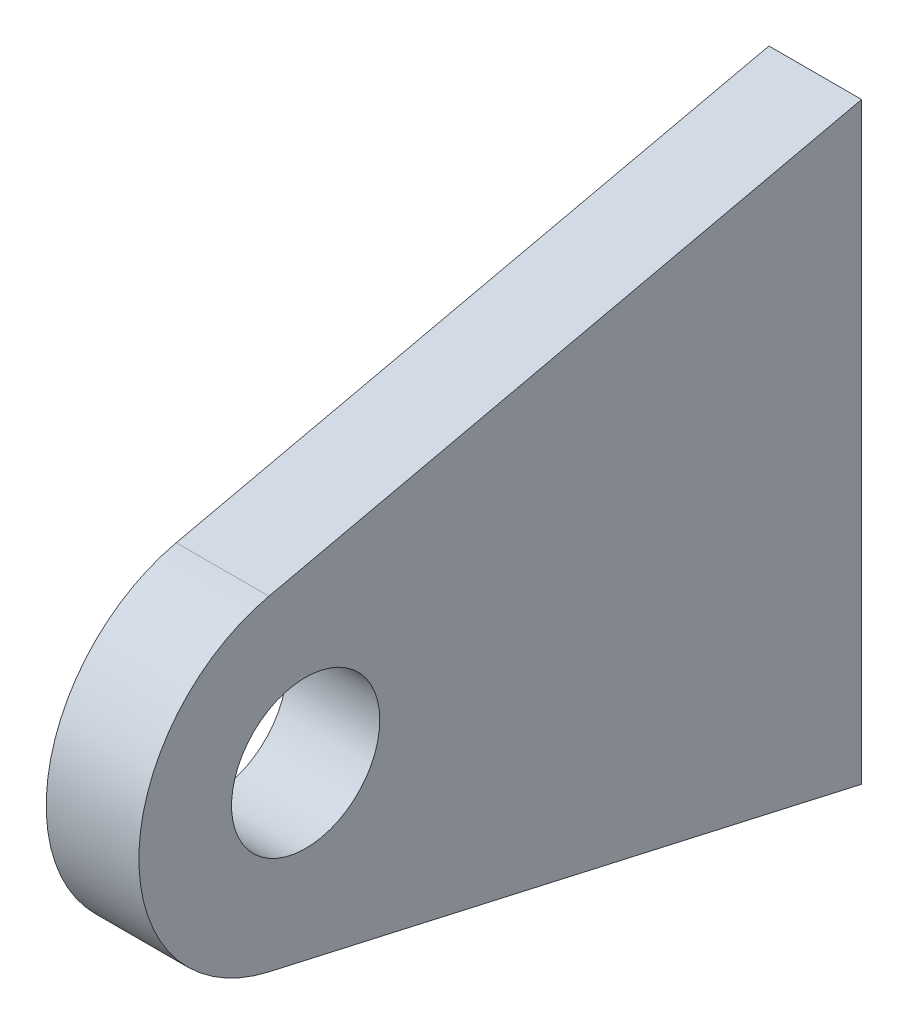
ISO-10303-21;
HEADER;
FILE_DESCRIPTION(('STEP AP214'),'2;1');
FILE_NAME('part.step','',(''),(''),'','','');
FILE_SCHEMA(('AUTOMOTIVE_DESIGN { 1 0 10303 214 1 1 1 1 }'));
ENDSEC;
DATA;
#1=APPLICATION_CONTEXT('core data for automotive mechanical design processes');
#2=APPLICATION_PROTOCOL_DEFINITION('international standard','automotive_design',2000,#1);
#3=PRODUCT_CONTEXT('',#1,'mechanical');
#4=PRODUCT('Part','Part','',(#3));
#5=PRODUCT_RELATED_PRODUCT_CATEGORY('part','',(#4));
#6=PRODUCT_DEFINITION_FORMATION('','',#4);
#7=PRODUCT_DEFINITION_CONTEXT('part definition',#1,'design');
#8=PRODUCT_DEFINITION('design','',#6,#7);
#9=PRODUCT_DEFINITION_SHAPE('','',#8);
#10=(LENGTH_UNIT() NAMED_UNIT(*) SI_UNIT(.MILLI.,.METRE.));
#11=(NAMED_UNIT(*) PLANE_ANGLE_UNIT() SI_UNIT($,.RADIAN.));
#12=(NAMED_UNIT(*) SI_UNIT($,.STERADIAN.) SOLID_ANGLE_UNIT());
#13=UNCERTAINTY_MEASURE_WITH_UNIT(LENGTH_MEASURE(1.E-05),#10,'distance_accuracy_value','');
#14=(GEOMETRIC_REPRESENTATION_CONTEXT(3) GLOBAL_UNCERTAINTY_ASSIGNED_CONTEXT((#13)) GLOBAL_UNIT_ASSIGNED_CONTEXT((#10,
#11,#12)) REPRESENTATION_CONTEXT('',''));
#15=CARTESIAN_POINT('',(0.,0.,0.));
#16=DIRECTION('',(0.,0.,1.));
#17=DIRECTION('',(1.,0.,0.));
#18=AXIS2_PLACEMENT_3D('',#15,#16,#17);
#19=CARTESIAN_POINT('',(2.5,0.,30.));
#20=DIRECTION('',(1.,0.,0.));
#21=DIRECTION('',(0.,0.,-1.));
#22=AXIS2_PLACEMENT_3D('',#19,#20,#21);
#23=PLANE('',#22);
#24=DIRECTION('',(0.,-0.220237960159308,0.975446175298703));
#25=VECTOR('',#24,1.);
#26=CARTESIAN_POINT('',(2.5,16.,0.));
#27=LINE('',#26,#25);
#28=CARTESIAN_POINT('',(2.5,16.,0.));
#29=VERTEX_POINT('',#28);
#30=CARTESIAN_POINT('',(2.5,8.77901557768832,31.9821416414338));
#31=VERTEX_POINT('',#30);
#32=EDGE_CURVE('E91',#29,#31,#27,.T.);
#33=ORIENTED_EDGE('',*,*,#32,.T.);
#34=CARTESIAN_POINT('',(2.5,0.,30.));
#35=DIRECTION('',(1.,0.,0.));
#36=DIRECTION('',(0.,0.,-1.));
#37=AXIS2_PLACEMENT_3D('',#34,#35,#36);
#38=CIRCLE('',#37,9.);
#39=CARTESIAN_POINT('',(2.5,-8.77901557768832,31.9821416414338));
#40=VERTEX_POINT('',#39);
#41=EDGE_CURVE('E86',#31,#40,#38,.T.);
#42=ORIENTED_EDGE('',*,*,#41,.T.);
#43=DIRECTION('',(0.,-0.220237960159308,-0.975446175298703));
#44=VECTOR('',#43,1.);
#45=CARTESIAN_POINT('',(2.5,-16.,0.));
#46=LINE('',#45,#44);
#47=CARTESIAN_POINT('',(2.5,-16.,0.));
#48=VERTEX_POINT('',#47);
#49=EDGE_CURVE('E89',#40,#48,#46,.T.);
#50=ORIENTED_EDGE('',*,*,#49,.T.);
#51=DIRECTION('',(0.,1.,0.));
#52=VECTOR('',#51,1.);
#53=CARTESIAN_POINT('',(2.5,-16.,0.));
#54=LINE('',#53,#52);
#55=EDGE_CURVE('E56',#48,#29,#54,.T.);
#56=ORIENTED_EDGE('',*,*,#55,.T.);
#57=EDGE_LOOP('',(#33,#42,#50,#56));
#58=FACE_BOUND('',#57,.T.);
#59=CARTESIAN_POINT('',(2.5,0.,30.));
#60=DIRECTION('',(1.,0.,0.));
#61=DIRECTION('',(0.,0.,-1.));
#62=AXIS2_PLACEMENT_3D('',#59,#60,#61);
#63=CIRCLE('',#62,4.);
#64=CARTESIAN_POINT('',(2.5,0.,26.));
#65=VERTEX_POINT('',#64);
#66=EDGE_CURVE('E106',#65,#65,#63,.T.);
#67=ORIENTED_EDGE('',*,*,#66,.F.);
#68=EDGE_LOOP('',(#67));
#69=FACE_BOUND('',#68,.T.);
#70=ADVANCED_FACE('F39',(#58,#69),#23,.T.);
#71=CARTESIAN_POINT('',(-2.5,0.,30.));
#72=DIRECTION('',(1.,0.,0.));
#73=DIRECTION('',(0.,0.,-1.));
#74=AXIS2_PLACEMENT_3D('',#71,#72,#73);
#75=PLANE('',#74);
#76=DIRECTION('',(0.,-0.220237960159308,0.975446175298703));
#77=VECTOR('',#76,1.);
#78=CARTESIAN_POINT('',(-2.5,16.,0.));
#79=LINE('',#78,#77);
#80=CARTESIAN_POINT('',(-2.5,16.,0.));
#81=VERTEX_POINT('',#80);
#82=CARTESIAN_POINT('',(-2.5,8.77901557768832,31.9821416414338));
#83=VERTEX_POINT('',#82);
#84=EDGE_CURVE('E103',#81,#83,#79,.T.);
#85=ORIENTED_EDGE('',*,*,#84,.F.);
#86=DIRECTION('',(0.,1.,0.));
#87=VECTOR('',#86,1.);
#88=CARTESIAN_POINT('',(-2.5,-16.,0.));
#89=LINE('',#88,#87);
#90=CARTESIAN_POINT('',(-2.5,-16.,0.));
#91=VERTEX_POINT('',#90);
#92=EDGE_CURVE('E79',#91,#81,#89,.T.);
#93=ORIENTED_EDGE('',*,*,#92,.F.);
#94=DIRECTION('',(0.,-0.220237960159308,-0.975446175298703));
#95=VECTOR('',#94,1.);
#96=CARTESIAN_POINT('',(-2.5,-16.,0.));
#97=LINE('',#96,#95);
#98=CARTESIAN_POINT('',(-2.5,-8.77901557768832,31.9821416414338));
#99=VERTEX_POINT('',#98);
#100=EDGE_CURVE('E73',#99,#91,#97,.T.);
#101=ORIENTED_EDGE('',*,*,#100,.F.);
#102=CARTESIAN_POINT('',(-2.5,0.,30.));
#103=DIRECTION('',(1.,0.,0.));
#104=DIRECTION('',(0.,0.,-1.));
#105=AXIS2_PLACEMENT_3D('',#102,#103,#104);
#106=CIRCLE('',#105,9.);
#107=EDGE_CURVE('E95',#83,#99,#106,.T.);
#108=ORIENTED_EDGE('',*,*,#107,.F.);
#109=EDGE_LOOP('',(#85,#93,#101,#108));
#110=FACE_BOUND('',#109,.T.);
#111=CARTESIAN_POINT('',(-2.5,0.,30.));
#112=DIRECTION('',(1.,0.,0.));
#113=DIRECTION('',(0.,0.,-1.));
#114=AXIS2_PLACEMENT_3D('',#111,#112,#113);
#115=CIRCLE('',#114,4.);
#116=CARTESIAN_POINT('',(-2.5,0.,26.));
#117=VERTEX_POINT('',#116);
#118=EDGE_CURVE('E118',#117,#117,#115,.T.);
#119=ORIENTED_EDGE('',*,*,#118,.T.);
#120=EDGE_LOOP('',(#119));
#121=FACE_BOUND('',#120,.T.);
#122=ADVANCED_FACE('F114',(#110,#121),#75,.F.);
#123=CARTESIAN_POINT('',(2.5,16.,0.));
#124=DIRECTION('',(0.,-0.975446175298703,-0.220237960159308));
#125=DIRECTION('',(0.,0.220237960159308,-0.975446175298703));
#126=AXIS2_PLACEMENT_3D('',#123,#124,#125);
#127=PLANE('',#126);
#128=ORIENTED_EDGE('',*,*,#84,.T.);
#129=DIRECTION('',(-1.,0.,0.));
#130=VECTOR('',#129,1.);
#131=CARTESIAN_POINT('',(2.5,8.77901557768832,31.9821416414338));
#132=LINE('',#131,#130);
#133=EDGE_CURVE('E11',#31,#83,#132,.T.);
#134=ORIENTED_EDGE('',*,*,#133,.F.);
#135=ORIENTED_EDGE('',*,*,#32,.F.);
#136=DIRECTION('',(-1.,0.,0.));
#137=VECTOR('',#136,1.);
#138=CARTESIAN_POINT('',(2.5,16.,0.));
#139=LINE('',#138,#137);
#140=EDGE_CURVE('E99',#29,#81,#139,.T.);
#141=ORIENTED_EDGE('',*,*,#140,.T.);
#142=EDGE_LOOP('',(#128,#134,#135,#141));
#143=FACE_BOUND('',#142,.T.);
#144=ADVANCED_FACE('F41',(#143),#127,.F.);
#145=CARTESIAN_POINT('',(2.5,0.,30.));
#146=DIRECTION('',(-1.,0.,0.));
#147=DIRECTION('',(0.,0.,1.));
#148=AXIS2_PLACEMENT_3D('',#145,#146,#147);
#149=CYLINDRICAL_SURFACE('',#148,9.);
#150=ORIENTED_EDGE('',*,*,#107,.T.);
#151=DIRECTION('',(-1.,0.,0.));
#152=VECTOR('',#151,1.);
#153=CARTESIAN_POINT('',(2.5,-8.77901557768832,31.9821416414338));
#154=LINE('',#153,#152);
#155=EDGE_CURVE('E48',#40,#99,#154,.T.);
#156=ORIENTED_EDGE('',*,*,#155,.F.);
#157=ORIENTED_EDGE('',*,*,#41,.F.);
#158=ORIENTED_EDGE('',*,*,#133,.T.);
#159=EDGE_LOOP('',(#150,#156,#157,#158));
#160=FACE_BOUND('',#159,.T.);
#161=ADVANCED_FACE('F94',(#160),#149,.T.);
#162=CARTESIAN_POINT('',(2.5,-16.,0.));
#163=DIRECTION('',(0.,0.975446175298703,-0.220237960159308));
#164=DIRECTION('',(0.,0.220237960159308,0.975446175298703));
#165=AXIS2_PLACEMENT_3D('',#162,#163,#164);
#166=PLANE('',#165);
#167=ORIENTED_EDGE('',*,*,#100,.T.);
#168=DIRECTION('',(-1.,0.,0.));
#169=VECTOR('',#168,1.);
#170=CARTESIAN_POINT('',(2.5,-16.,0.));
#171=LINE('',#170,#169);
#172=EDGE_CURVE('E96',#48,#91,#171,.T.);
#173=ORIENTED_EDGE('',*,*,#172,.F.);
#174=ORIENTED_EDGE('',*,*,#49,.F.);
#175=ORIENTED_EDGE('',*,*,#155,.T.);
#176=EDGE_LOOP('',(#167,#173,#174,#175));
#177=FACE_BOUND('',#176,.T.);
#178=ADVANCED_FACE('F97',(#177),#166,.F.);
#179=CARTESIAN_POINT('',(2.5,-16.,0.));
#180=DIRECTION('',(0.,0.,1.));
#181=DIRECTION('',(1.,0.,0.));
#182=AXIS2_PLACEMENT_3D('',#179,#180,#181);
#183=PLANE('',#182);
#184=ORIENTED_EDGE('',*,*,#92,.T.);
#185=ORIENTED_EDGE('',*,*,#140,.F.);
#186=ORIENTED_EDGE('',*,*,#55,.F.);
#187=ORIENTED_EDGE('',*,*,#172,.T.);
#188=EDGE_LOOP('',(#184,#185,#186,#187));
#189=FACE_BOUND('',#188,.T.);
#190=ADVANCED_FACE('F111',(#189),#183,.F.);
#191=CARTESIAN_POINT('',(2.5,0.,30.));
#192=DIRECTION('',(-1.,0.,0.));
#193=DIRECTION('',(0.,0.,1.));
#194=AXIS2_PLACEMENT_3D('',#191,#192,#193);
#195=CYLINDRICAL_SURFACE('',#194,4.);
#196=ORIENTED_EDGE('',*,*,#66,.T.);
#197=EDGE_LOOP('',(#196));
#198=FACE_BOUND('',#197,.T.);
#199=ORIENTED_EDGE('',*,*,#118,.F.);
#200=EDGE_LOOP('',(#199));
#201=FACE_BOUND('',#200,.T.);
#202=ADVANCED_FACE('F124',(#198,#201),#195,.F.);
#203=CLOSED_SHELL('',(#70,#122,#144,#161,#178,#190,#202));
#204=MANIFOLD_SOLID_BREP('B2',#203);
#205=ADVANCED_BREP_SHAPE_REPRESENTATION('',(#18,#204),#14);
#206=SHAPE_DEFINITION_REPRESENTATION(#9,#205);
ENDSEC;
END-ISO-10303-21;
